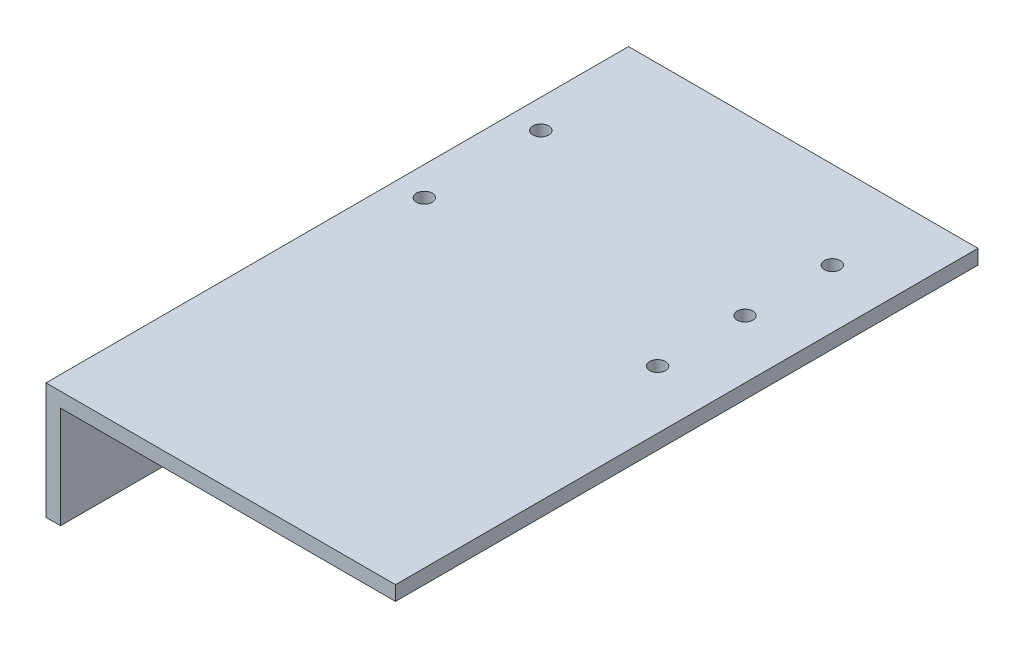
ISO-10303-21;
HEADER;
FILE_DESCRIPTION(('STEP AP214'),'2;1');
FILE_NAME('part.step','',(''),(''),'','','');
FILE_SCHEMA(('AUTOMOTIVE_DESIGN { 1 0 10303 214 1 1 1 1 }'));
ENDSEC;
DATA;
#1=APPLICATION_CONTEXT('core data for automotive mechanical design processes');
#2=APPLICATION_PROTOCOL_DEFINITION('international standard','automotive_design',2000,#1);
#3=PRODUCT_CONTEXT('',#1,'mechanical');
#4=PRODUCT('Part','Part','',(#3));
#5=PRODUCT_RELATED_PRODUCT_CATEGORY('part','',(#4));
#6=PRODUCT_DEFINITION_FORMATION('','',#4);
#7=PRODUCT_DEFINITION_CONTEXT('part definition',#1,'design');
#8=PRODUCT_DEFINITION('design','',#6,#7);
#9=PRODUCT_DEFINITION_SHAPE('','',#8);
#10=(LENGTH_UNIT() NAMED_UNIT(*) SI_UNIT(.MILLI.,.METRE.));
#11=(NAMED_UNIT(*) PLANE_ANGLE_UNIT() SI_UNIT($,.RADIAN.));
#12=(NAMED_UNIT(*) SI_UNIT($,.STERADIAN.) SOLID_ANGLE_UNIT());
#13=UNCERTAINTY_MEASURE_WITH_UNIT(LENGTH_MEASURE(1.E-05),#10,'distance_accuracy_value','');
#14=(GEOMETRIC_REPRESENTATION_CONTEXT(3) GLOBAL_UNCERTAINTY_ASSIGNED_CONTEXT((#13)) GLOBAL_UNIT_ASSIGNED_CONTEXT((#10,
#11,#12)) REPRESENTATION_CONTEXT('',''));
#15=CARTESIAN_POINT('',(0.,0.,0.));
#16=DIRECTION('',(0.,0.,1.));
#17=DIRECTION('',(1.,0.,0.));
#18=AXIS2_PLACEMENT_3D('',#15,#16,#17);
#19=CARTESIAN_POINT('',(0.,-3.17500000000001,76.2));
#20=DIRECTION('',(-1.,0.,0.));
#21=DIRECTION('',(0.,0.,1.));
#22=AXIS2_PLACEMENT_3D('',#19,#20,#21);
#23=PLANE('',#22);
#24=DIRECTION('',(0.,1.,0.));
#25=VECTOR('',#24,1.);
#26=CARTESIAN_POINT('',(0.,-3.17500000000001,0.));
#27=LINE('',#26,#25);
#28=CARTESIAN_POINT('',(0.,-3.17500000000001,0.));
#29=VERTEX_POINT('',#28);
#30=CARTESIAN_POINT('',(0.,0.,0.));
#31=VERTEX_POINT('',#30);
#32=EDGE_CURVE('E210',#29,#31,#27,.T.);
#33=ORIENTED_EDGE('',*,*,#32,.T.);
#34=DIRECTION('',(0.,0.,-1.));
#35=VECTOR('',#34,1.);
#36=CARTESIAN_POINT('',(0.,0.,76.2));
#37=LINE('',#36,#35);
#38=CARTESIAN_POINT('',(0.,0.,127.));
#39=VERTEX_POINT('',#38);
#40=EDGE_CURVE('E11',#39,#31,#37,.T.);
#41=ORIENTED_EDGE('',*,*,#40,.F.);
#42=DIRECTION('',(0.,1.,0.));
#43=VECTOR('',#42,1.);
#44=CARTESIAN_POINT('',(0.,-3.17500000000001,127.));
#45=LINE('',#44,#43);
#46=CARTESIAN_POINT('',(0.,-3.17500000000001,127.));
#47=VERTEX_POINT('',#46);
#48=EDGE_CURVE('E135',#47,#39,#45,.T.);
#49=ORIENTED_EDGE('',*,*,#48,.F.);
#50=DIRECTION('',(0.,0.,-1.));
#51=VECTOR('',#50,1.);
#52=CARTESIAN_POINT('',(0.,-3.17500000000001,76.2));
#53=LINE('',#52,#51);
#54=EDGE_CURVE('E222',#47,#29,#53,.T.);
#55=ORIENTED_EDGE('',*,*,#54,.T.);
#56=EDGE_LOOP('',(#33,#41,#49,#55));
#57=FACE_BOUND('',#56,.T.);
#58=ADVANCED_FACE('F35',(#57),#23,.F.);
#59=CARTESIAN_POINT('',(0.,0.,76.2));
#60=DIRECTION('',(0.,-1.,0.));
#61=DIRECTION('',(1.,0.,0.));
#62=AXIS2_PLACEMENT_3D('',#59,#60,#61);
#63=PLANE('',#62);
#64=CARTESIAN_POINT('',(-12.7,0.,19.05));
#65=DIRECTION('',(0.,1.,0.));
#66=DIRECTION('',(0.,0.,1.));
#67=AXIS2_PLACEMENT_3D('',#64,#65,#66);
#68=CIRCLE('',#67,1.72719999999999);
#69=CARTESIAN_POINT('',(-12.7,0.,20.7772));
#70=VERTEX_POINT('',#69);
#71=EDGE_CURVE('E145',#70,#70,#68,.T.);
#72=ORIENTED_EDGE('',*,*,#71,.F.);
#73=EDGE_LOOP('',(#72));
#74=FACE_BOUND('',#73,.T.);
#75=CARTESIAN_POINT('',(-12.7,0.,38.1));
#76=DIRECTION('',(0.,1.,0.));
#77=DIRECTION('',(0.,0.,1.));
#78=AXIS2_PLACEMENT_3D('',#75,#76,#77);
#79=CIRCLE('',#78,1.72719999999999);
#80=CARTESIAN_POINT('',(-12.7,0.,39.8272));
#81=VERTEX_POINT('',#80);
#82=EDGE_CURVE('E151',#81,#81,#79,.T.);
#83=ORIENTED_EDGE('',*,*,#82,.F.);
#84=EDGE_LOOP('',(#83));
#85=FACE_BOUND('',#84,.T.);
#86=CARTESIAN_POINT('',(-12.7,0.,57.15));
#87=DIRECTION('',(0.,1.,0.));
#88=DIRECTION('',(0.,0.,1.));
#89=AXIS2_PLACEMENT_3D('',#86,#87,#88);
#90=CIRCLE('',#89,1.72719999999999);
#91=CARTESIAN_POINT('',(-12.7,0.,58.8772));
#92=VERTEX_POINT('',#91);
#93=EDGE_CURVE('E154',#92,#92,#90,.T.);
#94=ORIENTED_EDGE('',*,*,#93,.F.);
#95=EDGE_LOOP('',(#94));
#96=FACE_BOUND('',#95,.T.);
#97=CARTESIAN_POINT('',(-69.9177386123245,0.,25.4));
#98=DIRECTION('',(0.,1.,0.));
#99=DIRECTION('',(0.,0.,1.));
#100=AXIS2_PLACEMENT_3D('',#97,#98,#99);
#101=CIRCLE('',#100,1.7272);
#102=CARTESIAN_POINT('',(-69.9177386123245,0.,27.1272));
#103=VERTEX_POINT('',#102);
#104=EDGE_CURVE('E186',#103,#103,#101,.T.);
#105=ORIENTED_EDGE('',*,*,#104,.F.);
#106=EDGE_LOOP('',(#105));
#107=FACE_BOUND('',#106,.T.);
#108=CARTESIAN_POINT('',(-69.9177386123245,0.,50.8));
#109=DIRECTION('',(0.,1.,0.));
#110=DIRECTION('',(0.,0.,1.));
#111=AXIS2_PLACEMENT_3D('',#108,#109,#110);
#112=CIRCLE('',#111,1.7272);
#113=CARTESIAN_POINT('',(-69.9177386123245,0.,52.5272));
#114=VERTEX_POINT('',#113);
#115=EDGE_CURVE('E192',#114,#114,#112,.T.);
#116=ORIENTED_EDGE('',*,*,#115,.F.);
#117=EDGE_LOOP('',(#116));
#118=FACE_BOUND('',#117,.T.);
#119=DIRECTION('',(-1.,0.,0.));
#120=VECTOR('',#119,1.);
#121=CARTESIAN_POINT('',(0.,0.,0.));
#122=LINE('',#121,#120);
#123=CARTESIAN_POINT('',(-76.2,0.,0.));
#124=VERTEX_POINT('',#123);
#125=EDGE_CURVE('E117',#31,#124,#122,.T.);
#126=ORIENTED_EDGE('',*,*,#125,.T.);
#127=DIRECTION('',(0.,0.,-1.));
#128=VECTOR('',#127,1.);
#129=CARTESIAN_POINT('',(-76.2,0.,76.2));
#130=LINE('',#129,#128);
#131=CARTESIAN_POINT('',(-76.2,0.,127.));
#132=VERTEX_POINT('',#131);
#133=EDGE_CURVE('E43',#132,#124,#130,.T.);
#134=ORIENTED_EDGE('',*,*,#133,.F.);
#135=DIRECTION('',(-1.,0.,0.));
#136=VECTOR('',#135,1.);
#137=CARTESIAN_POINT('',(0.,0.,127.));
#138=LINE('',#137,#136);
#139=EDGE_CURVE('E116',#39,#132,#138,.T.);
#140=ORIENTED_EDGE('',*,*,#139,.F.);
#141=ORIENTED_EDGE('',*,*,#40,.T.);
#142=EDGE_LOOP('',(#126,#134,#140,#141));
#143=FACE_BOUND('',#142,.T.);
#144=ADVANCED_FACE('F114',(#74,#85,#96,#107,#118,#143),#63,.F.);
#145=CARTESIAN_POINT('',(-76.2,0.,76.2));
#146=DIRECTION('',(1.,0.,0.));
#147=DIRECTION('',(0.,0.,-1.));
#148=AXIS2_PLACEMENT_3D('',#145,#146,#147);
#149=PLANE('',#148);
#150=DIRECTION('',(0.,0.,-1.));
#151=VECTOR('',#150,1.);
#152=CARTESIAN_POINT('',(-76.2,-13.589,36.449));
#153=LINE('',#152,#151);
#154=CARTESIAN_POINT('',(-76.2,-13.589,39.751));
#155=VERTEX_POINT('',#154);
#156=CARTESIAN_POINT('',(-76.2,-13.589,36.449));
#157=VERTEX_POINT('',#156);
#158=EDGE_CURVE('E166',#155,#157,#153,.T.);
#159=ORIENTED_EDGE('',*,*,#158,.F.);
#160=DIRECTION('',(0.,1.,0.));
#161=VECTOR('',#160,1.);
#162=CARTESIAN_POINT('',(-76.2,-16.891,39.751));
#163=LINE('',#162,#161);
#164=CARTESIAN_POINT('',(-76.2,-16.891,39.751));
#165=VERTEX_POINT('',#164);
#166=EDGE_CURVE('E51',#165,#155,#163,.T.);
#167=ORIENTED_EDGE('',*,*,#166,.F.);
#168=DIRECTION('',(0.,0.,1.));
#169=VECTOR('',#168,1.);
#170=CARTESIAN_POINT('',(-76.2,-16.891,36.449));
#171=LINE('',#170,#169);
#172=CARTESIAN_POINT('',(-76.2,-16.891,36.449));
#173=VERTEX_POINT('',#172);
#174=EDGE_CURVE('E172',#173,#165,#171,.T.);
#175=ORIENTED_EDGE('',*,*,#174,.F.);
#176=DIRECTION('',(0.,-1.,0.));
#177=VECTOR('',#176,1.);
#178=CARTESIAN_POINT('',(-76.2,-16.891,36.449));
#179=LINE('',#178,#177);
#180=EDGE_CURVE('E169',#157,#173,#179,.T.);
#181=ORIENTED_EDGE('',*,*,#180,.F.);
#182=EDGE_LOOP('',(#159,#167,#175,#181));
#183=FACE_BOUND('',#182,.T.);
#184=CARTESIAN_POINT('',(-76.2,-15.24,25.4));
#185=DIRECTION('',(-1.,0.,0.));
#186=DIRECTION('',(0.,0.,1.));
#187=AXIS2_PLACEMENT_3D('',#184,#185,#186);
#188=CIRCLE('',#187,1.35255);
#189=CARTESIAN_POINT('',(-76.2,-15.24,26.75255));
#190=VERTEX_POINT('',#189);
#191=EDGE_CURVE('E198',#190,#190,#188,.T.);
#192=ORIENTED_EDGE('',*,*,#191,.F.);
#193=EDGE_LOOP('',(#192));
#194=FACE_BOUND('',#193,.T.);
#195=CARTESIAN_POINT('',(-76.2,-15.24,12.7));
#196=DIRECTION('',(-1.,0.,0.));
#197=DIRECTION('',(0.,0.,1.));
#198=AXIS2_PLACEMENT_3D('',#195,#196,#197);
#199=CIRCLE('',#198,1.35255);
#200=CARTESIAN_POINT('',(-76.2,-15.24,14.05255));
#201=VERTEX_POINT('',#200);
#202=EDGE_CURVE('E204',#201,#201,#199,.T.);
#203=ORIENTED_EDGE('',*,*,#202,.F.);
#204=EDGE_LOOP('',(#203));
#205=FACE_BOUND('',#204,.T.);
#206=DIRECTION('',(0.,-1.,0.));
#207=VECTOR('',#206,1.);
#208=CARTESIAN_POINT('',(-76.2,0.,0.));
#209=LINE('',#208,#207);
#210=CARTESIAN_POINT('',(-76.2,-25.4,0.));
#211=VERTEX_POINT('',#210);
#212=EDGE_CURVE('E214',#124,#211,#209,.T.);
#213=ORIENTED_EDGE('',*,*,#212,.T.);
#214=DIRECTION('',(0.,0.,-1.));
#215=VECTOR('',#214,1.);
#216=CARTESIAN_POINT('',(-76.2,-25.4,76.2));
#217=LINE('',#216,#215);
#218=CARTESIAN_POINT('',(-76.2,-25.4,127.));
#219=VERTEX_POINT('',#218);
#220=EDGE_CURVE('E120',#219,#211,#217,.T.);
#221=ORIENTED_EDGE('',*,*,#220,.F.);
#222=DIRECTION('',(0.,-1.,0.));
#223=VECTOR('',#222,1.);
#224=CARTESIAN_POINT('',(-76.2,0.,127.));
#225=LINE('',#224,#223);
#226=EDGE_CURVE('E123',#132,#219,#225,.T.);
#227=ORIENTED_EDGE('',*,*,#226,.F.);
#228=ORIENTED_EDGE('',*,*,#133,.T.);
#229=EDGE_LOOP('',(#213,#221,#227,#228));
#230=FACE_BOUND('',#229,.T.);
#231=ADVANCED_FACE('F124',(#183,#194,#205,#230),#149,.F.);
#232=CARTESIAN_POINT('',(-76.2,-25.4,76.2));
#233=DIRECTION('',(0.,1.,0.));
#234=DIRECTION('',(0.,0.,1.));
#235=AXIS2_PLACEMENT_3D('',#232,#233,#234);
#236=PLANE('',#235);
#237=DIRECTION('',(1.,0.,0.));
#238=VECTOR('',#237,1.);
#239=CARTESIAN_POINT('',(-76.2,-25.4,0.));
#240=LINE('',#239,#238);
#241=CARTESIAN_POINT('',(-73.025,-25.4,0.));
#242=VERTEX_POINT('',#241);
#243=EDGE_CURVE('E216',#211,#242,#240,.T.);
#244=ORIENTED_EDGE('',*,*,#243,.T.);
#245=DIRECTION('',(0.,0.,-1.));
#246=VECTOR('',#245,1.);
#247=CARTESIAN_POINT('',(-73.025,-25.4,76.2));
#248=LINE('',#247,#246);
#249=CARTESIAN_POINT('',(-73.025,-25.4,127.));
#250=VERTEX_POINT('',#249);
#251=EDGE_CURVE('E228',#250,#242,#248,.T.);
#252=ORIENTED_EDGE('',*,*,#251,.F.);
#253=DIRECTION('',(1.,0.,0.));
#254=VECTOR('',#253,1.);
#255=CARTESIAN_POINT('',(-76.2,-25.4,127.));
#256=LINE('',#255,#254);
#257=EDGE_CURVE('E129',#219,#250,#256,.T.);
#258=ORIENTED_EDGE('',*,*,#257,.F.);
#259=ORIENTED_EDGE('',*,*,#220,.T.);
#260=EDGE_LOOP('',(#244,#252,#258,#259));
#261=FACE_BOUND('',#260,.T.);
#262=ADVANCED_FACE('F268',(#261),#236,.F.);
#263=CARTESIAN_POINT('',(-73.025,-25.4,76.2));
#264=DIRECTION('',(-1.,0.,0.));
#265=DIRECTION('',(0.,0.,1.));
#266=AXIS2_PLACEMENT_3D('',#263,#264,#265);
#267=PLANE('',#266);
#268=DIRECTION('',(0.,0.,-1.));
#269=VECTOR('',#268,1.);
#270=CARTESIAN_POINT('',(-73.025,-16.891,36.449));
#271=LINE('',#270,#269);
#272=CARTESIAN_POINT('',(-73.025,-16.891,39.751));
#273=VERTEX_POINT('',#272);
#274=CARTESIAN_POINT('',(-73.025,-16.891,36.449));
#275=VERTEX_POINT('',#274);
#276=EDGE_CURVE('E159',#273,#275,#271,.T.);
#277=ORIENTED_EDGE('',*,*,#276,.F.);
#278=DIRECTION('',(0.,-1.,0.));
#279=VECTOR('',#278,1.);
#280=CARTESIAN_POINT('',(-73.025,-16.891,39.751));
#281=LINE('',#280,#279);
#282=CARTESIAN_POINT('',(-73.025,-13.589,39.751));
#283=VERTEX_POINT('',#282);
#284=EDGE_CURVE('E162',#283,#273,#281,.T.);
#285=ORIENTED_EDGE('',*,*,#284,.F.);
#286=DIRECTION('',(0.,0.,1.));
#287=VECTOR('',#286,1.);
#288=CARTESIAN_POINT('',(-73.025,-13.589,36.449));
#289=LINE('',#288,#287);
#290=CARTESIAN_POINT('',(-73.025,-13.589,36.449));
#291=VERTEX_POINT('',#290);
#292=EDGE_CURVE('E178',#291,#283,#289,.T.);
#293=ORIENTED_EDGE('',*,*,#292,.F.);
#294=DIRECTION('',(0.,1.,0.));
#295=VECTOR('',#294,1.);
#296=CARTESIAN_POINT('',(-73.025,-16.891,36.449));
#297=LINE('',#296,#295);
#298=EDGE_CURVE('E59',#275,#291,#297,.T.);
#299=ORIENTED_EDGE('',*,*,#298,.F.);
#300=EDGE_LOOP('',(#277,#285,#293,#299));
#301=FACE_BOUND('',#300,.T.);
#302=CARTESIAN_POINT('',(-73.025,-15.24,25.4));
#303=DIRECTION('',(-1.,0.,0.));
#304=DIRECTION('',(0.,0.,1.));
#305=AXIS2_PLACEMENT_3D('',#302,#303,#304);
#306=CIRCLE('',#305,1.35254999999999);
#307=CARTESIAN_POINT('',(-73.025,-15.24,26.75255));
#308=VERTEX_POINT('',#307);
#309=EDGE_CURVE('E201',#308,#308,#306,.T.);
#310=ORIENTED_EDGE('',*,*,#309,.T.);
#311=EDGE_LOOP('',(#310));
#312=FACE_BOUND('',#311,.T.);
#313=CARTESIAN_POINT('',(-73.025,-15.24,12.7));
#314=DIRECTION('',(-1.,0.,0.));
#315=DIRECTION('',(0.,0.,1.));
#316=AXIS2_PLACEMENT_3D('',#313,#314,#315);
#317=CIRCLE('',#316,1.35254999999999);
#318=CARTESIAN_POINT('',(-73.025,-15.24,14.05255));
#319=VERTEX_POINT('',#318);
#320=EDGE_CURVE('E207',#319,#319,#317,.T.);
#321=ORIENTED_EDGE('',*,*,#320,.T.);
#322=EDGE_LOOP('',(#321));
#323=FACE_BOUND('',#322,.T.);
#324=DIRECTION('',(0.,1.,0.));
#325=VECTOR('',#324,1.);
#326=CARTESIAN_POINT('',(-73.025,-25.4,0.));
#327=LINE('',#326,#325);
#328=CARTESIAN_POINT('',(-73.025,-3.17500000000001,0.));
#329=VERTEX_POINT('',#328);
#330=EDGE_CURVE('E218',#242,#329,#327,.T.);
#331=ORIENTED_EDGE('',*,*,#330,.T.);
#332=DIRECTION('',(0.,0.,-1.));
#333=VECTOR('',#332,1.);
#334=CARTESIAN_POINT('',(-73.025,-3.17500000000001,76.2));
#335=LINE('',#334,#333);
#336=CARTESIAN_POINT('',(-73.025,-3.17500000000001,127.));
#337=VERTEX_POINT('',#336);
#338=EDGE_CURVE('E225',#337,#329,#335,.T.);
#339=ORIENTED_EDGE('',*,*,#338,.F.);
#340=DIRECTION('',(0.,1.,0.));
#341=VECTOR('',#340,1.);
#342=CARTESIAN_POINT('',(-73.025,-25.4,127.));
#343=LINE('',#342,#341);
#344=EDGE_CURVE('E139',#250,#337,#343,.T.);
#345=ORIENTED_EDGE('',*,*,#344,.F.);
#346=ORIENTED_EDGE('',*,*,#251,.T.);
#347=EDGE_LOOP('',(#331,#339,#345,#346));
#348=FACE_BOUND('',#347,.T.);
#349=ADVANCED_FACE('F272',(#301,#312,#323,#348),#267,.F.);
#350=CARTESIAN_POINT('',(-73.025,-3.17500000000001,76.2));
#351=DIRECTION('',(0.,1.,0.));
#352=DIRECTION('',(-1.,0.,0.));
#353=AXIS2_PLACEMENT_3D('',#350,#351,#352);
#354=PLANE('',#353);
#355=CARTESIAN_POINT('',(-12.7,-3.17500000000001,19.05));
#356=DIRECTION('',(0.,1.,0.));
#357=DIRECTION('',(-1.,0.,0.));
#358=AXIS2_PLACEMENT_3D('',#355,#356,#357);
#359=CIRCLE('',#358,1.72719999999999);
#360=CARTESIAN_POINT('',(-14.4272,-3.17500000000001,19.05));
#361=VERTEX_POINT('',#360);
#362=EDGE_CURVE('E148',#361,#361,#359,.T.);
#363=ORIENTED_EDGE('',*,*,#362,.T.);
#364=EDGE_LOOP('',(#363));
#365=FACE_BOUND('',#364,.T.);
#366=CARTESIAN_POINT('',(-12.7,-3.17500000000001,38.1));
#367=DIRECTION('',(0.,1.,0.));
#368=DIRECTION('',(-1.,0.,0.));
#369=AXIS2_PLACEMENT_3D('',#366,#367,#368);
#370=CIRCLE('',#369,1.72719999999999);
#371=CARTESIAN_POINT('',(-14.4272,-3.17500000000001,38.1));
#372=VERTEX_POINT('',#371);
#373=EDGE_CURVE('E38',#372,#372,#370,.T.);
#374=ORIENTED_EDGE('',*,*,#373,.T.);
#375=EDGE_LOOP('',(#374));
#376=FACE_BOUND('',#375,.T.);
#377=CARTESIAN_POINT('',(-12.7,-3.17500000000001,57.15));
#378=DIRECTION('',(0.,1.,0.));
#379=DIRECTION('',(-1.,0.,0.));
#380=AXIS2_PLACEMENT_3D('',#377,#378,#379);
#381=CIRCLE('',#380,1.72719999999999);
#382=CARTESIAN_POINT('',(-14.4272,-3.17500000000001,57.15));
#383=VERTEX_POINT('',#382);
#384=EDGE_CURVE('E157',#383,#383,#381,.T.);
#385=ORIENTED_EDGE('',*,*,#384,.T.);
#386=EDGE_LOOP('',(#385));
#387=FACE_BOUND('',#386,.T.);
#388=CARTESIAN_POINT('',(-69.9177386123245,-3.17500000000001,25.4));
#389=DIRECTION('',(0.,1.,0.));
#390=DIRECTION('',(-1.,0.,0.));
#391=AXIS2_PLACEMENT_3D('',#388,#389,#390);
#392=CIRCLE('',#391,1.7272);
#393=CARTESIAN_POINT('',(-71.6449386123245,-3.17500000000001,25.4));
#394=VERTEX_POINT('',#393);
#395=EDGE_CURVE('E189',#394,#394,#392,.T.);
#396=ORIENTED_EDGE('',*,*,#395,.T.);
#397=EDGE_LOOP('',(#396));
#398=FACE_BOUND('',#397,.T.);
#399=CARTESIAN_POINT('',(-69.9177386123245,-3.17500000000001,50.8));
#400=DIRECTION('',(0.,1.,0.));
#401=DIRECTION('',(-1.,0.,0.));
#402=AXIS2_PLACEMENT_3D('',#399,#400,#401);
#403=CIRCLE('',#402,1.7272);
#404=CARTESIAN_POINT('',(-71.6449386123245,-3.17500000000001,50.8));
#405=VERTEX_POINT('',#404);
#406=EDGE_CURVE('E195',#405,#405,#403,.T.);
#407=ORIENTED_EDGE('',*,*,#406,.T.);
#408=EDGE_LOOP('',(#407));
#409=FACE_BOUND('',#408,.T.);
#410=DIRECTION('',(1.,0.,0.));
#411=VECTOR('',#410,1.);
#412=CARTESIAN_POINT('',(-73.025,-3.17500000000001,0.));
#413=LINE('',#412,#411);
#414=EDGE_CURVE('E220',#329,#29,#413,.T.);
#415=ORIENTED_EDGE('',*,*,#414,.T.);
#416=ORIENTED_EDGE('',*,*,#54,.F.);
#417=DIRECTION('',(1.,0.,0.));
#418=VECTOR('',#417,1.);
#419=CARTESIAN_POINT('',(-73.025,-3.17500000000001,127.));
#420=LINE('',#419,#418);
#421=EDGE_CURVE('E142',#337,#47,#420,.T.);
#422=ORIENTED_EDGE('',*,*,#421,.F.);
#423=ORIENTED_EDGE('',*,*,#338,.T.);
#424=EDGE_LOOP('',(#415,#416,#422,#423));
#425=FACE_BOUND('',#424,.T.);
#426=ADVANCED_FACE('F234',(#365,#376,#387,#398,#409,#425),#354,.F.);
#427=CARTESIAN_POINT('',(0.,0.,0.));
#428=DIRECTION('',(0.,0.,1.));
#429=DIRECTION('',(1.,0.,0.));
#430=AXIS2_PLACEMENT_3D('',#427,#428,#429);
#431=PLANE('',#430);
#432=ORIENTED_EDGE('',*,*,#32,.F.);
#433=ORIENTED_EDGE('',*,*,#414,.F.);
#434=ORIENTED_EDGE('',*,*,#330,.F.);
#435=ORIENTED_EDGE('',*,*,#243,.F.);
#436=ORIENTED_EDGE('',*,*,#212,.F.);
#437=ORIENTED_EDGE('',*,*,#125,.F.);
#438=EDGE_LOOP('',(#432,#433,#434,#435,#436,#437));
#439=FACE_BOUND('',#438,.T.);
#440=ADVANCED_FACE('F264',(#439),#431,.F.);
#441=CARTESIAN_POINT('',(-76.2,-15.24,12.7));
#442=DIRECTION('',(-1.,0.,0.));
#443=DIRECTION('',(0.,0.,1.));
#444=AXIS2_PLACEMENT_3D('',#441,#442,#443);
#445=CYLINDRICAL_SURFACE('',#444,1.35254999999999);
#446=ORIENTED_EDGE('',*,*,#202,.T.);
#447=EDGE_LOOP('',(#446));
#448=FACE_BOUND('',#447,.T.);
#449=ORIENTED_EDGE('',*,*,#320,.F.);
#450=EDGE_LOOP('',(#449));
#451=FACE_BOUND('',#450,.T.);
#452=ADVANCED_FACE('F282',(#448,#451),#445,.F.);
#453=CARTESIAN_POINT('',(-76.2,-15.24,25.4));
#454=DIRECTION('',(-1.,0.,0.));
#455=DIRECTION('',(0.,0.,1.));
#456=AXIS2_PLACEMENT_3D('',#453,#454,#455);
#457=CYLINDRICAL_SURFACE('',#456,1.35254999999999);
#458=ORIENTED_EDGE('',*,*,#191,.T.);
#459=EDGE_LOOP('',(#458));
#460=FACE_BOUND('',#459,.T.);
#461=ORIENTED_EDGE('',*,*,#309,.F.);
#462=EDGE_LOOP('',(#461));
#463=FACE_BOUND('',#462,.T.);
#464=ADVANCED_FACE('F304',(#460,#463),#457,.F.);
#465=CARTESIAN_POINT('',(-69.9177386123245,0.,50.8));
#466=DIRECTION('',(0.,1.,0.));
#467=DIRECTION('',(0.,0.,1.));
#468=AXIS2_PLACEMENT_3D('',#465,#466,#467);
#469=CYLINDRICAL_SURFACE('',#468,1.7272);
#470=ORIENTED_EDGE('',*,*,#115,.T.);
#471=EDGE_LOOP('',(#470));
#472=FACE_BOUND('',#471,.T.);
#473=ORIENTED_EDGE('',*,*,#406,.F.);
#474=EDGE_LOOP('',(#473));
#475=FACE_BOUND('',#474,.T.);
#476=ADVANCED_FACE('F310',(#472,#475),#469,.F.);
#477=CARTESIAN_POINT('',(-69.9177386123245,0.,25.4));
#478=DIRECTION('',(0.,1.,0.));
#479=DIRECTION('',(0.,0.,1.));
#480=AXIS2_PLACEMENT_3D('',#477,#478,#479);
#481=CYLINDRICAL_SURFACE('',#480,1.7272);
#482=ORIENTED_EDGE('',*,*,#104,.T.);
#483=EDGE_LOOP('',(#482));
#484=FACE_BOUND('',#483,.T.);
#485=ORIENTED_EDGE('',*,*,#395,.F.);
#486=EDGE_LOOP('',(#485));
#487=FACE_BOUND('',#486,.T.);
#488=ADVANCED_FACE('F316',(#484,#487),#481,.F.);
#489=CARTESIAN_POINT('',(0.001000000000001,-16.891,39.751));
#490=DIRECTION('',(0.,0.,1.));
#491=DIRECTION('',(1.,0.,0.));
#492=AXIS2_PLACEMENT_3D('',#489,#490,#491);
#493=PLANE('',#492);
#494=ORIENTED_EDGE('',*,*,#284,.T.);
#495=DIRECTION('',(-1.,0.,0.));
#496=VECTOR('',#495,1.);
#497=CARTESIAN_POINT('',(0.001000000000001,-16.891,39.751));
#498=LINE('',#497,#496);
#499=EDGE_CURVE('E176',#273,#165,#498,.T.);
#500=ORIENTED_EDGE('',*,*,#499,.T.);
#501=ORIENTED_EDGE('',*,*,#166,.T.);
#502=DIRECTION('',(-1.,0.,0.));
#503=VECTOR('',#502,1.);
#504=CARTESIAN_POINT('',(0.001000000000001,-13.589,39.751));
#505=LINE('',#504,#503);
#506=EDGE_CURVE('E175',#283,#155,#505,.T.);
#507=ORIENTED_EDGE('',*,*,#506,.F.);
#508=EDGE_LOOP('',(#494,#500,#501,#507));
#509=FACE_BOUND('',#508,.T.);
#510=ADVANCED_FACE('F320',(#509),#493,.F.);
#511=CARTESIAN_POINT('',(0.001000000000001,-16.891,36.449));
#512=DIRECTION('',(0.,-1.,0.));
#513=DIRECTION('',(0.,0.,-1.));
#514=AXIS2_PLACEMENT_3D('',#511,#512,#513);
#515=PLANE('',#514);
#516=ORIENTED_EDGE('',*,*,#276,.T.);
#517=DIRECTION('',(-1.,0.,0.));
#518=VECTOR('',#517,1.);
#519=CARTESIAN_POINT('',(0.001000000000001,-16.891,36.449));
#520=LINE('',#519,#518);
#521=EDGE_CURVE('E179',#275,#173,#520,.T.);
#522=ORIENTED_EDGE('',*,*,#521,.T.);
#523=ORIENTED_EDGE('',*,*,#174,.T.);
#524=ORIENTED_EDGE('',*,*,#499,.F.);
#525=EDGE_LOOP('',(#516,#522,#523,#524));
#526=FACE_BOUND('',#525,.T.);
#527=ADVANCED_FACE('F323',(#526),#515,.F.);
#528=CARTESIAN_POINT('',(0.001000000000001,-16.891,36.449));
#529=DIRECTION('',(0.,0.,-1.));
#530=DIRECTION('',(-1.,0.,0.));
#531=AXIS2_PLACEMENT_3D('',#528,#529,#530);
#532=PLANE('',#531);
#533=ORIENTED_EDGE('',*,*,#298,.T.);
#534=DIRECTION('',(-1.,0.,0.));
#535=VECTOR('',#534,1.);
#536=CARTESIAN_POINT('',(0.001000000000001,-13.589,36.449));
#537=LINE('',#536,#535);
#538=EDGE_CURVE('E181',#291,#157,#537,.T.);
#539=ORIENTED_EDGE('',*,*,#538,.T.);
#540=ORIENTED_EDGE('',*,*,#180,.T.);
#541=ORIENTED_EDGE('',*,*,#521,.F.);
#542=EDGE_LOOP('',(#533,#539,#540,#541));
#543=FACE_BOUND('',#542,.T.);
#544=ADVANCED_FACE('F250',(#543),#532,.F.);
#545=CARTESIAN_POINT('',(0.001000000000001,-13.589,36.449));
#546=DIRECTION('',(0.,1.,0.));
#547=DIRECTION('',(0.,0.,1.));
#548=AXIS2_PLACEMENT_3D('',#545,#546,#547);
#549=PLANE('',#548);
#550=ORIENTED_EDGE('',*,*,#292,.T.);
#551=ORIENTED_EDGE('',*,*,#506,.T.);
#552=ORIENTED_EDGE('',*,*,#158,.T.);
#553=ORIENTED_EDGE('',*,*,#538,.F.);
#554=EDGE_LOOP('',(#550,#551,#552,#553));
#555=FACE_BOUND('',#554,.T.);
#556=ADVANCED_FACE('F240',(#555),#549,.F.);
#557=CARTESIAN_POINT('',(-12.7,0.,57.15));
#558=DIRECTION('',(0.,1.,0.));
#559=DIRECTION('',(0.,0.,1.));
#560=AXIS2_PLACEMENT_3D('',#557,#558,#559);
#561=CYLINDRICAL_SURFACE('',#560,1.72719999999999);
#562=ORIENTED_EDGE('',*,*,#93,.T.);
#563=EDGE_LOOP('',(#562));
#564=FACE_BOUND('',#563,.T.);
#565=ORIENTED_EDGE('',*,*,#384,.F.);
#566=EDGE_LOOP('',(#565));
#567=FACE_BOUND('',#566,.T.);
#568=ADVANCED_FACE('F237',(#564,#567),#561,.F.);
#569=CARTESIAN_POINT('',(-12.7,0.,38.1));
#570=DIRECTION('',(0.,1.,0.));
#571=DIRECTION('',(0.,0.,1.));
#572=AXIS2_PLACEMENT_3D('',#569,#570,#571);
#573=CYLINDRICAL_SURFACE('',#572,1.72719999999999);
#574=ORIENTED_EDGE('',*,*,#82,.T.);
#575=EDGE_LOOP('',(#574));
#576=FACE_BOUND('',#575,.T.);
#577=ORIENTED_EDGE('',*,*,#373,.F.);
#578=EDGE_LOOP('',(#577));
#579=FACE_BOUND('',#578,.T.);
#580=ADVANCED_FACE('F239',(#576,#579),#573,.F.);
#581=CARTESIAN_POINT('',(-12.7,0.,19.05));
#582=DIRECTION('',(0.,1.,0.));
#583=DIRECTION('',(0.,0.,1.));
#584=AXIS2_PLACEMENT_3D('',#581,#582,#583);
#585=CYLINDRICAL_SURFACE('',#584,1.72719999999999);
#586=ORIENTED_EDGE('',*,*,#71,.T.);
#587=EDGE_LOOP('',(#586));
#588=FACE_BOUND('',#587,.T.);
#589=ORIENTED_EDGE('',*,*,#362,.F.);
#590=EDGE_LOOP('',(#589));
#591=FACE_BOUND('',#590,.T.);
#592=ADVANCED_FACE('F247',(#588,#591),#585,.F.);
#593=CARTESIAN_POINT('',(0.,0.,127.));
#594=DIRECTION('',(0.,0.,1.));
#595=DIRECTION('',(1.,0.,0.));
#596=AXIS2_PLACEMENT_3D('',#593,#594,#595);
#597=PLANE('',#596);
#598=ORIENTED_EDGE('',*,*,#139,.T.);
#599=ORIENTED_EDGE('',*,*,#226,.T.);
#600=ORIENTED_EDGE('',*,*,#257,.T.);
#601=ORIENTED_EDGE('',*,*,#344,.T.);
#602=ORIENTED_EDGE('',*,*,#421,.T.);
#603=ORIENTED_EDGE('',*,*,#48,.T.);
#604=EDGE_LOOP('',(#598,#599,#600,#601,#602,#603));
#605=FACE_BOUND('',#604,.T.);
#606=ADVANCED_FACE('F132',(#605),#597,.T.);
#607=CLOSED_SHELL('',(#58,#144,#231,#262,#349,#426,#440,#452,#464,#476,#488,#510,#527,#544,#556,
#568,#580,#592,#606));
#608=MANIFOLD_SOLID_BREP('B2',#607);
#609=ADVANCED_BREP_SHAPE_REPRESENTATION('',(#18,#608),#14);
#610=SHAPE_DEFINITION_REPRESENTATION(#9,#609);
ENDSEC;
END-ISO-10303-21;
